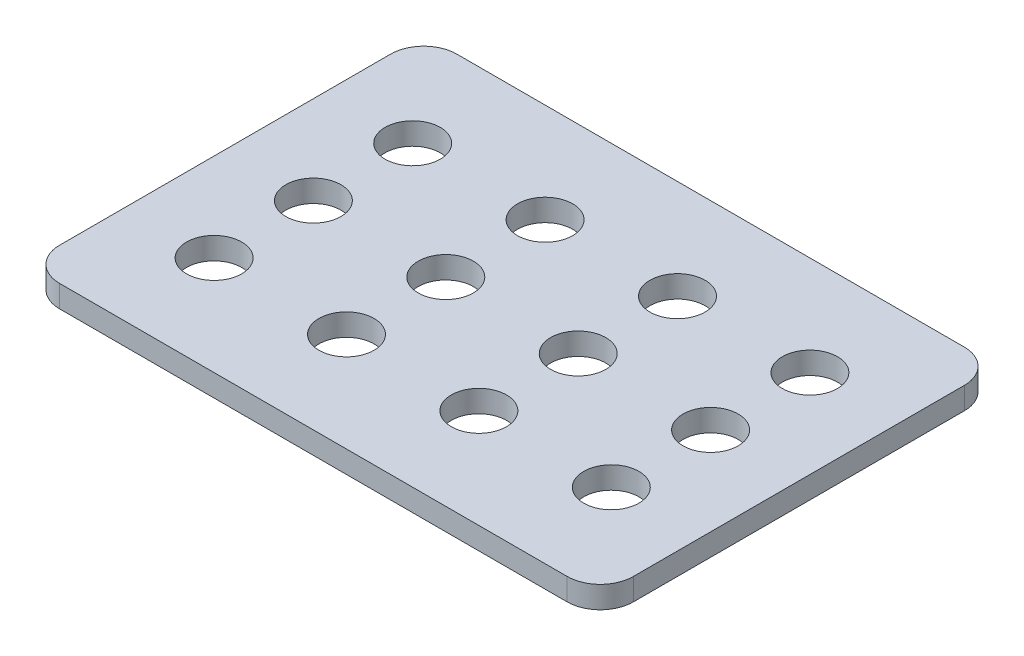
ISO-10303-21;
HEADER;
FILE_DESCRIPTION(('STEP AP214'),'2;1');
FILE_NAME('part.step','',(''),(''),'','','');
FILE_SCHEMA(('AUTOMOTIVE_DESIGN { 1 0 10303 214 1 1 1 1 }'));
ENDSEC;
DATA;
#1=APPLICATION_CONTEXT('core data for automotive mechanical design processes');
#2=APPLICATION_PROTOCOL_DEFINITION('international standard','automotive_design',2000,#1);
#3=PRODUCT_CONTEXT('',#1,'mechanical');
#4=PRODUCT('Part','Part','',(#3));
#5=PRODUCT_RELATED_PRODUCT_CATEGORY('part','',(#4));
#6=PRODUCT_DEFINITION_FORMATION('','',#4);
#7=PRODUCT_DEFINITION_CONTEXT('part definition',#1,'design');
#8=PRODUCT_DEFINITION('design','',#6,#7);
#9=PRODUCT_DEFINITION_SHAPE('','',#8);
#10=(LENGTH_UNIT() NAMED_UNIT(*) SI_UNIT(.MILLI.,.METRE.));
#11=(NAMED_UNIT(*) PLANE_ANGLE_UNIT() SI_UNIT($,.RADIAN.));
#12=(NAMED_UNIT(*) SI_UNIT($,.STERADIAN.) SOLID_ANGLE_UNIT());
#13=UNCERTAINTY_MEASURE_WITH_UNIT(LENGTH_MEASURE(1.E-05),#10,'distance_accuracy_value','');
#14=(GEOMETRIC_REPRESENTATION_CONTEXT(3) GLOBAL_UNCERTAINTY_ASSIGNED_CONTEXT((#13)) GLOBAL_UNIT_ASSIGNED_CONTEXT((#10,
#11,#12)) REPRESENTATION_CONTEXT('',''));
#15=CARTESIAN_POINT('',(0.,0.,0.));
#16=DIRECTION('',(0.,0.,1.));
#17=DIRECTION('',(1.,0.,0.));
#18=AXIS2_PLACEMENT_3D('',#15,#16,#17);
#19=CARTESIAN_POINT('',(15.,-10.,-15.));
#20=DIRECTION('',(0.,1.,0.));
#21=DIRECTION('',(0.,0.,1.));
#22=AXIS2_PLACEMENT_3D('',#19,#20,#21);
#23=CYLINDRICAL_SURFACE('',#22,15.);
#24=CARTESIAN_POINT('',(15.,0.,-15.));
#25=DIRECTION('',(0.,1.,0.));
#26=DIRECTION('',(0.,0.,-1.));
#27=AXIS2_PLACEMENT_3D('',#24,#25,#26);
#28=CIRCLE('',#27,15.);
#29=CARTESIAN_POINT('',(0.,0.,-15.0000000000001));
#30=VERTEX_POINT('',#29);
#31=CARTESIAN_POINT('',(15.0000000000001,0.,0.));
#32=VERTEX_POINT('',#31);
#33=EDGE_CURVE('E136',#30,#32,#28,.T.);
#34=ORIENTED_EDGE('',*,*,#33,.F.);
#35=DIRECTION('',(0.,1.,0.));
#36=VECTOR('',#35,1.);
#37=CARTESIAN_POINT('',(0.,-10.,-15.0000000000001));
#38=LINE('',#37,#36);
#39=CARTESIAN_POINT('',(0.,-10.,-15.0000000000001));
#40=VERTEX_POINT('',#39);
#41=EDGE_CURVE('E11',#40,#30,#38,.T.);
#42=ORIENTED_EDGE('',*,*,#41,.F.);
#43=CARTESIAN_POINT('',(15.,-10.,-15.));
#44=DIRECTION('',(0.,1.,0.));
#45=DIRECTION('',(0.,0.,-1.));
#46=AXIS2_PLACEMENT_3D('',#43,#44,#45);
#47=CIRCLE('',#46,15.);
#48=CARTESIAN_POINT('',(15.0000000000001,-10.,0.));
#49=VERTEX_POINT('',#48);
#50=EDGE_CURVE('E160',#40,#49,#47,.T.);
#51=ORIENTED_EDGE('',*,*,#50,.T.);
#52=DIRECTION('',(0.,1.,0.));
#53=VECTOR('',#52,1.);
#54=CARTESIAN_POINT('',(15.0000000000001,-10.,0.));
#55=LINE('',#54,#53);
#56=EDGE_CURVE('E45',#49,#32,#55,.T.);
#57=ORIENTED_EDGE('',*,*,#56,.T.);
#58=EDGE_LOOP('',(#34,#42,#51,#57));
#59=FACE_BOUND('',#58,.T.);
#60=ADVANCED_FACE('F39',(#59),#23,.T.);
#61=CARTESIAN_POINT('',(0.,-10.,-15.0000000000001));
#62=DIRECTION('',(-1.,0.,0.));
#63=DIRECTION('',(0.,0.,1.));
#64=AXIS2_PLACEMENT_3D('',#61,#62,#63);
#65=PLANE('',#64);
#66=DIRECTION('',(0.,0.,1.));
#67=VECTOR('',#66,1.);
#68=CARTESIAN_POINT('',(0.,0.,-15.0000000000001));
#69=LINE('',#68,#67);
#70=CARTESIAN_POINT('',(0.,0.,-165.));
#71=VERTEX_POINT('',#70);
#72=EDGE_CURVE('E153',#71,#30,#69,.T.);
#73=ORIENTED_EDGE('',*,*,#72,.F.);
#74=DIRECTION('',(0.,1.,0.));
#75=VECTOR('',#74,1.);
#76=CARTESIAN_POINT('',(0.,-10.,-165.));
#77=LINE('',#76,#75);
#78=CARTESIAN_POINT('',(0.,-10.,-165.));
#79=VERTEX_POINT('',#78);
#80=EDGE_CURVE('E48',#79,#71,#77,.T.);
#81=ORIENTED_EDGE('',*,*,#80,.F.);
#82=DIRECTION('',(0.,0.,1.));
#83=VECTOR('',#82,1.);
#84=CARTESIAN_POINT('',(0.,-10.,-15.0000000000001));
#85=LINE('',#84,#83);
#86=EDGE_CURVE('E128',#79,#40,#85,.T.);
#87=ORIENTED_EDGE('',*,*,#86,.T.);
#88=ORIENTED_EDGE('',*,*,#41,.T.);
#89=EDGE_LOOP('',(#73,#81,#87,#88));
#90=FACE_BOUND('',#89,.T.);
#91=ADVANCED_FACE('F170',(#90),#65,.T.);
#92=CARTESIAN_POINT('',(15.,-10.,-165.));
#93=DIRECTION('',(0.,1.,0.));
#94=DIRECTION('',(0.,0.,1.));
#95=AXIS2_PLACEMENT_3D('',#92,#93,#94);
#96=CYLINDRICAL_SURFACE('',#95,15.);
#97=CARTESIAN_POINT('',(15.,0.,-165.));
#98=DIRECTION('',(0.,1.,0.));
#99=DIRECTION('',(0.,0.,-1.));
#100=AXIS2_PLACEMENT_3D('',#97,#98,#99);
#101=CIRCLE('',#100,15.);
#102=CARTESIAN_POINT('',(15.0000000000001,0.,-180.));
#103=VERTEX_POINT('',#102);
#104=EDGE_CURVE('E111',#103,#71,#101,.T.);
#105=ORIENTED_EDGE('',*,*,#104,.F.);
#106=DIRECTION('',(0.,1.,0.));
#107=VECTOR('',#106,1.);
#108=CARTESIAN_POINT('',(15.0000000000001,-10.,-180.));
#109=LINE('',#108,#107);
#110=CARTESIAN_POINT('',(15.0000000000001,-10.,-180.));
#111=VERTEX_POINT('',#110);
#112=EDGE_CURVE('E110',#111,#103,#109,.T.);
#113=ORIENTED_EDGE('',*,*,#112,.F.);
#114=CARTESIAN_POINT('',(15.,-10.,-165.));
#115=DIRECTION('',(0.,1.,0.));
#116=DIRECTION('',(0.,0.,-1.));
#117=AXIS2_PLACEMENT_3D('',#114,#115,#116);
#118=CIRCLE('',#117,15.);
#119=EDGE_CURVE('E112',#111,#79,#118,.T.);
#120=ORIENTED_EDGE('',*,*,#119,.T.);
#121=ORIENTED_EDGE('',*,*,#80,.T.);
#122=EDGE_LOOP('',(#105,#113,#120,#121));
#123=FACE_BOUND('',#122,.T.);
#124=ADVANCED_FACE('F108',(#123),#96,.T.);
#125=CARTESIAN_POINT('',(15.0000000000001,-10.,-180.));
#126=DIRECTION('',(0.,0.,-1.));
#127=DIRECTION('',(-1.,0.,0.));
#128=AXIS2_PLACEMENT_3D('',#125,#126,#127);
#129=PLANE('',#128);
#130=DIRECTION('',(-1.,0.,0.));
#131=VECTOR('',#130,1.);
#132=CARTESIAN_POINT('',(15.0000000000001,0.,-180.));
#133=LINE('',#132,#131);
#134=CARTESIAN_POINT('',(245.,0.,-180.));
#135=VERTEX_POINT('',#134);
#136=EDGE_CURVE('E154',#135,#103,#133,.T.);
#137=ORIENTED_EDGE('',*,*,#136,.F.);
#138=DIRECTION('',(0.,1.,0.));
#139=VECTOR('',#138,1.);
#140=CARTESIAN_POINT('',(245.,-10.,-180.));
#141=LINE('',#140,#139);
#142=CARTESIAN_POINT('',(245.,-10.,-180.));
#143=VERTEX_POINT('',#142);
#144=EDGE_CURVE('E120',#143,#135,#141,.T.);
#145=ORIENTED_EDGE('',*,*,#144,.F.);
#146=DIRECTION('',(-1.,0.,0.));
#147=VECTOR('',#146,1.);
#148=CARTESIAN_POINT('',(15.0000000000001,-10.,-180.));
#149=LINE('',#148,#147);
#150=EDGE_CURVE('E125',#143,#111,#149,.T.);
#151=ORIENTED_EDGE('',*,*,#150,.T.);
#152=ORIENTED_EDGE('',*,*,#112,.T.);
#153=EDGE_LOOP('',(#137,#145,#151,#152));
#154=FACE_BOUND('',#153,.T.);
#155=ADVANCED_FACE('F126',(#154),#129,.T.);
#156=CARTESIAN_POINT('',(245.,-10.,-165.));
#157=DIRECTION('',(0.,1.,0.));
#158=DIRECTION('',(0.,0.,1.));
#159=AXIS2_PLACEMENT_3D('',#156,#157,#158);
#160=CYLINDRICAL_SURFACE('',#159,15.);
#161=CARTESIAN_POINT('',(245.,0.,-165.));
#162=DIRECTION('',(0.,1.,0.));
#163=DIRECTION('',(0.,0.,-1.));
#164=AXIS2_PLACEMENT_3D('',#161,#162,#163);
#165=CIRCLE('',#164,15.);
#166=CARTESIAN_POINT('',(260.,0.,-165.));
#167=VERTEX_POINT('',#166);
#168=EDGE_CURVE('E146',#167,#135,#165,.T.);
#169=ORIENTED_EDGE('',*,*,#168,.F.);
#170=DIRECTION('',(0.,1.,0.));
#171=VECTOR('',#170,1.);
#172=CARTESIAN_POINT('',(260.,-10.,-165.));
#173=LINE('',#172,#171);
#174=CARTESIAN_POINT('',(260.,-10.,-165.));
#175=VERTEX_POINT('',#174);
#176=EDGE_CURVE('E162',#175,#167,#173,.T.);
#177=ORIENTED_EDGE('',*,*,#176,.F.);
#178=CARTESIAN_POINT('',(245.,-10.,-165.));
#179=DIRECTION('',(0.,1.,0.));
#180=DIRECTION('',(0.,0.,-1.));
#181=AXIS2_PLACEMENT_3D('',#178,#179,#180);
#182=CIRCLE('',#181,15.);
#183=EDGE_CURVE('E129',#175,#143,#182,.T.);
#184=ORIENTED_EDGE('',*,*,#183,.T.);
#185=ORIENTED_EDGE('',*,*,#144,.T.);
#186=EDGE_LOOP('',(#169,#177,#184,#185));
#187=FACE_BOUND('',#186,.T.);
#188=ADVANCED_FACE('F185',(#187),#160,.T.);
#189=CARTESIAN_POINT('',(260.,-10.,-15.0000000000001));
#190=DIRECTION('',(1.,0.,0.));
#191=DIRECTION('',(0.,0.,-1.));
#192=AXIS2_PLACEMENT_3D('',#189,#190,#191);
#193=PLANE('',#192);
#194=DIRECTION('',(0.,0.,-1.));
#195=VECTOR('',#194,1.);
#196=CARTESIAN_POINT('',(260.,0.,-15.0000000000001));
#197=LINE('',#196,#195);
#198=CARTESIAN_POINT('',(260.,0.,-15.0000000000001));
#199=VERTEX_POINT('',#198);
#200=EDGE_CURVE('E147',#199,#167,#197,.T.);
#201=ORIENTED_EDGE('',*,*,#200,.F.);
#202=DIRECTION('',(0.,1.,0.));
#203=VECTOR('',#202,1.);
#204=CARTESIAN_POINT('',(260.,-10.,-15.0000000000001));
#205=LINE('',#204,#203);
#206=CARTESIAN_POINT('',(260.,-10.,-15.0000000000001));
#207=VERTEX_POINT('',#206);
#208=EDGE_CURVE('E165',#207,#199,#205,.T.);
#209=ORIENTED_EDGE('',*,*,#208,.F.);
#210=DIRECTION('',(0.,0.,-1.));
#211=VECTOR('',#210,1.);
#212=CARTESIAN_POINT('',(260.,-10.,-15.0000000000001));
#213=LINE('',#212,#211);
#214=EDGE_CURVE('E131',#207,#175,#213,.T.);
#215=ORIENTED_EDGE('',*,*,#214,.T.);
#216=ORIENTED_EDGE('',*,*,#176,.T.);
#217=EDGE_LOOP('',(#201,#209,#215,#216));
#218=FACE_BOUND('',#217,.T.);
#219=ADVANCED_FACE('F184',(#218),#193,.T.);
#220=CARTESIAN_POINT('',(245.,-10.,-15.));
#221=DIRECTION('',(0.,1.,0.));
#222=DIRECTION('',(0.,0.,1.));
#223=AXIS2_PLACEMENT_3D('',#220,#221,#222);
#224=CYLINDRICAL_SURFACE('',#223,15.);
#225=CARTESIAN_POINT('',(245.,0.,-15.));
#226=DIRECTION('',(0.,1.,0.));
#227=DIRECTION('',(0.,0.,1.));
#228=AXIS2_PLACEMENT_3D('',#225,#226,#227);
#229=CIRCLE('',#228,15.);
#230=CARTESIAN_POINT('',(245.,0.,0.));
#231=VERTEX_POINT('',#230);
#232=EDGE_CURVE('E142',#231,#199,#229,.T.);
#233=ORIENTED_EDGE('',*,*,#232,.F.);
#234=DIRECTION('',(0.,1.,0.));
#235=VECTOR('',#234,1.);
#236=CARTESIAN_POINT('',(245.,-10.,0.));
#237=LINE('',#236,#235);
#238=CARTESIAN_POINT('',(245.,-10.,0.));
#239=VERTEX_POINT('',#238);
#240=EDGE_CURVE('E161',#239,#231,#237,.T.);
#241=ORIENTED_EDGE('',*,*,#240,.F.);
#242=CARTESIAN_POINT('',(245.,-10.,-15.));
#243=DIRECTION('',(0.,1.,0.));
#244=DIRECTION('',(0.,0.,1.));
#245=AXIS2_PLACEMENT_3D('',#242,#243,#244);
#246=CIRCLE('',#245,15.);
#247=EDGE_CURVE('E332',#239,#207,#246,.T.);
#248=ORIENTED_EDGE('',*,*,#247,.T.);
#249=ORIENTED_EDGE('',*,*,#208,.T.);
#250=EDGE_LOOP('',(#233,#241,#248,#249));
#251=FACE_BOUND('',#250,.T.);
#252=ADVANCED_FACE('F188',(#251),#224,.T.);
#253=CARTESIAN_POINT('',(15.0000000000001,-10.,0.));
#254=DIRECTION('',(0.,0.,1.));
#255=DIRECTION('',(1.,0.,0.));
#256=AXIS2_PLACEMENT_3D('',#253,#254,#255);
#257=PLANE('',#256);
#258=DIRECTION('',(1.,0.,0.));
#259=VECTOR('',#258,1.);
#260=CARTESIAN_POINT('',(15.0000000000001,0.,0.));
#261=LINE('',#260,#259);
#262=EDGE_CURVE('E137',#32,#231,#261,.T.);
#263=ORIENTED_EDGE('',*,*,#262,.F.);
#264=ORIENTED_EDGE('',*,*,#56,.F.);
#265=DIRECTION('',(1.,0.,0.));
#266=VECTOR('',#265,1.);
#267=CARTESIAN_POINT('',(15.0000000000001,-10.,0.));
#268=LINE('',#267,#266);
#269=EDGE_CURVE('E326',#49,#239,#268,.T.);
#270=ORIENTED_EDGE('',*,*,#269,.T.);
#271=ORIENTED_EDGE('',*,*,#240,.T.);
#272=EDGE_LOOP('',(#263,#264,#270,#271));
#273=FACE_BOUND('',#272,.T.);
#274=ADVANCED_FACE('F168',(#273),#257,.T.);
#275=CARTESIAN_POINT('',(15.,-10.,-15.));
#276=DIRECTION('',(0.,-1.,0.));
#277=DIRECTION('',(0.,0.,-1.));
#278=AXIS2_PLACEMENT_3D('',#275,#276,#277);
#279=PLANE('',#278);
#280=CARTESIAN_POINT('',(40.0000000000009,-10.,-45.));
#281=DIRECTION('',(0.,1.,0.));
#282=DIRECTION('',(0.,0.,1.));
#283=AXIS2_PLACEMENT_3D('',#280,#281,#282);
#284=CIRCLE('',#283,12.5);
#285=CARTESIAN_POINT('',(40.0000000000009,-10.,-32.5));
#286=VERTEX_POINT('',#285);
#287=EDGE_CURVE('E258',#286,#286,#284,.T.);
#288=ORIENTED_EDGE('',*,*,#287,.T.);
#289=EDGE_LOOP('',(#288));
#290=FACE_BOUND('',#289,.T.);
#291=CARTESIAN_POINT('',(40.0000000000005,-10.,-90.));
#292=DIRECTION('',(0.,1.,0.));
#293=DIRECTION('',(0.,0.,1.));
#294=AXIS2_PLACEMENT_3D('',#291,#292,#293);
#295=CIRCLE('',#294,12.5);
#296=CARTESIAN_POINT('',(40.0000000000005,-10.,-77.5));
#297=VERTEX_POINT('',#296);
#298=EDGE_CURVE('E264',#297,#297,#295,.T.);
#299=ORIENTED_EDGE('',*,*,#298,.T.);
#300=EDGE_LOOP('',(#299));
#301=FACE_BOUND('',#300,.T.);
#302=CARTESIAN_POINT('',(220.000000000001,-10.,-45.));
#303=DIRECTION('',(0.,1.,0.));
#304=DIRECTION('',(0.,0.,1.));
#305=AXIS2_PLACEMENT_3D('',#302,#303,#304);
#306=CIRCLE('',#305,12.5);
#307=CARTESIAN_POINT('',(220.000000000001,-10.,-32.5));
#308=VERTEX_POINT('',#307);
#309=EDGE_CURVE('E269',#308,#308,#306,.T.);
#310=ORIENTED_EDGE('',*,*,#309,.T.);
#311=EDGE_LOOP('',(#310));
#312=FACE_BOUND('',#311,.T.);
#313=CARTESIAN_POINT('',(160.000000000001,-10.,-45.));
#314=DIRECTION('',(0.,1.,0.));
#315=DIRECTION('',(0.,0.,1.));
#316=AXIS2_PLACEMENT_3D('',#313,#314,#315);
#317=CIRCLE('',#316,12.5);
#318=CARTESIAN_POINT('',(160.000000000001,-10.,-32.5));
#319=VERTEX_POINT('',#318);
#320=EDGE_CURVE('E276',#319,#319,#317,.T.);
#321=ORIENTED_EDGE('',*,*,#320,.T.);
#322=EDGE_LOOP('',(#321));
#323=FACE_BOUND('',#322,.T.);
#324=CARTESIAN_POINT('',(100.000000000001,-10.,-45.));
#325=DIRECTION('',(0.,1.,0.));
#326=DIRECTION('',(0.,0.,1.));
#327=AXIS2_PLACEMENT_3D('',#324,#325,#326);
#328=CIRCLE('',#327,12.5);
#329=CARTESIAN_POINT('',(100.000000000001,-10.,-32.5));
#330=VERTEX_POINT('',#329);
#331=EDGE_CURVE('E285',#330,#330,#328,.T.);
#332=ORIENTED_EDGE('',*,*,#331,.T.);
#333=EDGE_LOOP('',(#332));
#334=FACE_BOUND('',#333,.T.);
#335=CARTESIAN_POINT('',(220.,-10.,-90.));
#336=DIRECTION('',(0.,1.,0.));
#337=DIRECTION('',(0.,0.,1.));
#338=AXIS2_PLACEMENT_3D('',#335,#336,#337);
#339=CIRCLE('',#338,12.5);
#340=CARTESIAN_POINT('',(220.,-10.,-77.5));
#341=VERTEX_POINT('',#340);
#342=EDGE_CURVE('E290',#341,#341,#339,.T.);
#343=ORIENTED_EDGE('',*,*,#342,.T.);
#344=EDGE_LOOP('',(#343));
#345=FACE_BOUND('',#344,.T.);
#346=CARTESIAN_POINT('',(160.,-10.,-90.));
#347=DIRECTION('',(0.,1.,0.));
#348=DIRECTION('',(0.,0.,1.));
#349=AXIS2_PLACEMENT_3D('',#346,#347,#348);
#350=CIRCLE('',#349,12.5);
#351=CARTESIAN_POINT('',(160.,-10.,-77.5));
#352=VERTEX_POINT('',#351);
#353=EDGE_CURVE('E294',#352,#352,#350,.T.);
#354=ORIENTED_EDGE('',*,*,#353,.T.);
#355=EDGE_LOOP('',(#354));
#356=FACE_BOUND('',#355,.T.);
#357=CARTESIAN_POINT('',(100.,-10.,-90.));
#358=DIRECTION('',(0.,1.,0.));
#359=DIRECTION('',(0.,0.,1.));
#360=AXIS2_PLACEMENT_3D('',#357,#358,#359);
#361=CIRCLE('',#360,12.5);
#362=CARTESIAN_POINT('',(100.,-10.,-77.5));
#363=VERTEX_POINT('',#362);
#364=EDGE_CURVE('E298',#363,#363,#361,.T.);
#365=ORIENTED_EDGE('',*,*,#364,.T.);
#366=EDGE_LOOP('',(#365));
#367=FACE_BOUND('',#366,.T.);
#368=CARTESIAN_POINT('',(220.,-10.,-135.));
#369=DIRECTION('',(0.,1.,0.));
#370=DIRECTION('',(0.,0.,1.));
#371=AXIS2_PLACEMENT_3D('',#368,#369,#370);
#372=CIRCLE('',#371,12.5);
#373=CARTESIAN_POINT('',(220.,-10.,-122.5));
#374=VERTEX_POINT('',#373);
#375=EDGE_CURVE('E308',#374,#374,#372,.T.);
#376=ORIENTED_EDGE('',*,*,#375,.T.);
#377=EDGE_LOOP('',(#376));
#378=FACE_BOUND('',#377,.T.);
#379=CARTESIAN_POINT('',(160.,-10.,-135.));
#380=DIRECTION('',(0.,1.,0.));
#381=DIRECTION('',(0.,0.,1.));
#382=AXIS2_PLACEMENT_3D('',#379,#380,#381);
#383=CIRCLE('',#382,12.5);
#384=CARTESIAN_POINT('',(160.,-10.,-122.5));
#385=VERTEX_POINT('',#384);
#386=EDGE_CURVE('E315',#385,#385,#383,.T.);
#387=ORIENTED_EDGE('',*,*,#386,.T.);
#388=EDGE_LOOP('',(#387));
#389=FACE_BOUND('',#388,.T.);
#390=CARTESIAN_POINT('',(100.,-10.,-135.));
#391=DIRECTION('',(0.,1.,0.));
#392=DIRECTION('',(0.,0.,1.));
#393=AXIS2_PLACEMENT_3D('',#390,#391,#392);
#394=CIRCLE('',#393,12.5);
#395=CARTESIAN_POINT('',(100.,-10.,-122.5));
#396=VERTEX_POINT('',#395);
#397=EDGE_CURVE('E318',#396,#396,#394,.T.);
#398=ORIENTED_EDGE('',*,*,#397,.T.);
#399=EDGE_LOOP('',(#398));
#400=FACE_BOUND('',#399,.T.);
#401=CARTESIAN_POINT('',(40.,-10.,-135.));
#402=DIRECTION('',(0.,1.,0.));
#403=DIRECTION('',(0.,0.,1.));
#404=AXIS2_PLACEMENT_3D('',#401,#402,#403);
#405=CIRCLE('',#404,12.5);
#406=CARTESIAN_POINT('',(40.,-10.,-122.5));
#407=VERTEX_POINT('',#406);
#408=EDGE_CURVE('E139',#407,#407,#405,.T.);
#409=ORIENTED_EDGE('',*,*,#408,.T.);
#410=EDGE_LOOP('',(#409));
#411=FACE_BOUND('',#410,.T.);
#412=ORIENTED_EDGE('',*,*,#50,.F.);
#413=ORIENTED_EDGE('',*,*,#86,.F.);
#414=ORIENTED_EDGE('',*,*,#119,.F.);
#415=ORIENTED_EDGE('',*,*,#150,.F.);
#416=ORIENTED_EDGE('',*,*,#183,.F.);
#417=ORIENTED_EDGE('',*,*,#214,.F.);
#418=ORIENTED_EDGE('',*,*,#247,.F.);
#419=ORIENTED_EDGE('',*,*,#269,.F.);
#420=EDGE_LOOP('',(#412,#413,#414,#415,#416,#417,#418,#419));
#421=FACE_BOUND('',#420,.T.);
#422=ADVANCED_FACE('F122',(#290,#301,#312,#323,#334,#345,#356,#367,#378,#389,#400,#411,#421),
#279,.T.);
#423=CARTESIAN_POINT('',(15.,0.,-15.));
#424=DIRECTION('',(0.,-1.,0.));
#425=DIRECTION('',(0.,0.,-1.));
#426=AXIS2_PLACEMENT_3D('',#423,#424,#425);
#427=PLANE('',#426);
#428=CARTESIAN_POINT('',(40.0000000000009,0.,-45.));
#429=DIRECTION('',(0.,1.,0.));
#430=DIRECTION('',(0.,0.,1.));
#431=AXIS2_PLACEMENT_3D('',#428,#429,#430);
#432=CIRCLE('',#431,12.5);
#433=CARTESIAN_POINT('',(40.0000000000009,0.,-32.5));
#434=VERTEX_POINT('',#433);
#435=EDGE_CURVE('E260',#434,#434,#432,.T.);
#436=ORIENTED_EDGE('',*,*,#435,.F.);
#437=EDGE_LOOP('',(#436));
#438=FACE_BOUND('',#437,.T.);
#439=CARTESIAN_POINT('',(40.0000000000005,0.,-90.));
#440=DIRECTION('',(0.,1.,0.));
#441=DIRECTION('',(0.,0.,1.));
#442=AXIS2_PLACEMENT_3D('',#439,#440,#441);
#443=CIRCLE('',#442,12.5);
#444=CARTESIAN_POINT('',(40.0000000000005,0.,-77.5));
#445=VERTEX_POINT('',#444);
#446=EDGE_CURVE('E263',#445,#445,#443,.T.);
#447=ORIENTED_EDGE('',*,*,#446,.F.);
#448=EDGE_LOOP('',(#447));
#449=FACE_BOUND('',#448,.T.);
#450=CARTESIAN_POINT('',(220.000000000001,0.,-45.));
#451=DIRECTION('',(0.,1.,0.));
#452=DIRECTION('',(0.,0.,1.));
#453=AXIS2_PLACEMENT_3D('',#450,#451,#452);
#454=CIRCLE('',#453,12.5);
#455=CARTESIAN_POINT('',(220.000000000001,0.,-32.5));
#456=VERTEX_POINT('',#455);
#457=EDGE_CURVE('E270',#456,#456,#454,.T.);
#458=ORIENTED_EDGE('',*,*,#457,.F.);
#459=EDGE_LOOP('',(#458));
#460=FACE_BOUND('',#459,.T.);
#461=CARTESIAN_POINT('',(160.000000000001,0.,-45.));
#462=DIRECTION('',(0.,1.,0.));
#463=DIRECTION('',(0.,0.,1.));
#464=AXIS2_PLACEMENT_3D('',#461,#462,#463);
#465=CIRCLE('',#464,12.5);
#466=CARTESIAN_POINT('',(160.000000000001,0.,-32.5));
#467=VERTEX_POINT('',#466);
#468=EDGE_CURVE('E273',#467,#467,#465,.T.);
#469=ORIENTED_EDGE('',*,*,#468,.F.);
#470=EDGE_LOOP('',(#469));
#471=FACE_BOUND('',#470,.T.);
#472=CARTESIAN_POINT('',(100.000000000001,0.,-45.));
#473=DIRECTION('',(0.,1.,0.));
#474=DIRECTION('',(0.,0.,1.));
#475=AXIS2_PLACEMENT_3D('',#472,#473,#474);
#476=CIRCLE('',#475,12.5);
#477=CARTESIAN_POINT('',(100.000000000001,0.,-32.5));
#478=VERTEX_POINT('',#477);
#479=EDGE_CURVE('E278',#478,#478,#476,.T.);
#480=ORIENTED_EDGE('',*,*,#479,.F.);
#481=EDGE_LOOP('',(#480));
#482=FACE_BOUND('',#481,.T.);
#483=CARTESIAN_POINT('',(220.,0.,-90.));
#484=DIRECTION('',(0.,1.,0.));
#485=DIRECTION('',(0.,0.,1.));
#486=AXIS2_PLACEMENT_3D('',#483,#484,#485);
#487=CIRCLE('',#486,12.5);
#488=CARTESIAN_POINT('',(220.,0.,-77.5));
#489=VERTEX_POINT('',#488);
#490=EDGE_CURVE('E283',#489,#489,#487,.T.);
#491=ORIENTED_EDGE('',*,*,#490,.F.);
#492=EDGE_LOOP('',(#491));
#493=FACE_BOUND('',#492,.T.);
#494=CARTESIAN_POINT('',(160.,0.,-90.));
#495=DIRECTION('',(0.,1.,0.));
#496=DIRECTION('',(0.,0.,1.));
#497=AXIS2_PLACEMENT_3D('',#494,#495,#496);
#498=CIRCLE('',#497,12.5);
#499=CARTESIAN_POINT('',(160.,0.,-77.5));
#500=VERTEX_POINT('',#499);
#501=EDGE_CURVE('E292',#500,#500,#498,.T.);
#502=ORIENTED_EDGE('',*,*,#501,.F.);
#503=EDGE_LOOP('',(#502));
#504=FACE_BOUND('',#503,.T.);
#505=CARTESIAN_POINT('',(100.,0.,-90.));
#506=DIRECTION('',(0.,1.,0.));
#507=DIRECTION('',(0.,0.,1.));
#508=AXIS2_PLACEMENT_3D('',#505,#506,#507);
#509=CIRCLE('',#508,12.5);
#510=CARTESIAN_POINT('',(100.,0.,-77.5));
#511=VERTEX_POINT('',#510);
#512=EDGE_CURVE('E299',#511,#511,#509,.T.);
#513=ORIENTED_EDGE('',*,*,#512,.F.);
#514=EDGE_LOOP('',(#513));
#515=FACE_BOUND('',#514,.T.);
#516=CARTESIAN_POINT('',(220.,0.,-135.));
#517=DIRECTION('',(0.,1.,0.));
#518=DIRECTION('',(0.,0.,1.));
#519=AXIS2_PLACEMENT_3D('',#516,#517,#518);
#520=CIRCLE('',#519,12.5);
#521=CARTESIAN_POINT('',(220.,0.,-122.5));
#522=VERTEX_POINT('',#521);
#523=EDGE_CURVE('E301',#522,#522,#520,.T.);
#524=ORIENTED_EDGE('',*,*,#523,.F.);
#525=EDGE_LOOP('',(#524));
#526=FACE_BOUND('',#525,.T.);
#527=CARTESIAN_POINT('',(160.,0.,-135.));
#528=DIRECTION('',(0.,1.,0.));
#529=DIRECTION('',(0.,0.,1.));
#530=AXIS2_PLACEMENT_3D('',#527,#528,#529);
#531=CIRCLE('',#530,12.5);
#532=CARTESIAN_POINT('',(160.,0.,-122.5));
#533=VERTEX_POINT('',#532);
#534=EDGE_CURVE('E309',#533,#533,#531,.T.);
#535=ORIENTED_EDGE('',*,*,#534,.F.);
#536=EDGE_LOOP('',(#535));
#537=FACE_BOUND('',#536,.T.);
#538=CARTESIAN_POINT('',(100.,0.,-135.));
#539=DIRECTION('',(0.,1.,0.));
#540=DIRECTION('',(0.,0.,1.));
#541=AXIS2_PLACEMENT_3D('',#538,#539,#540);
#542=CIRCLE('',#541,12.5);
#543=CARTESIAN_POINT('',(100.,0.,-122.5));
#544=VERTEX_POINT('',#543);
#545=EDGE_CURVE('E314',#544,#544,#542,.T.);
#546=ORIENTED_EDGE('',*,*,#545,.F.);
#547=EDGE_LOOP('',(#546));
#548=FACE_BOUND('',#547,.T.);
#549=CARTESIAN_POINT('',(40.,0.,-135.));
#550=DIRECTION('',(0.,1.,0.));
#551=DIRECTION('',(0.,0.,1.));
#552=AXIS2_PLACEMENT_3D('',#549,#550,#551);
#553=CIRCLE('',#552,12.5);
#554=CARTESIAN_POINT('',(40.,0.,-122.5));
#555=VERTEX_POINT('',#554);
#556=EDGE_CURVE('E321',#555,#555,#553,.T.);
#557=ORIENTED_EDGE('',*,*,#556,.F.);
#558=EDGE_LOOP('',(#557));
#559=FACE_BOUND('',#558,.T.);
#560=ORIENTED_EDGE('',*,*,#33,.T.);
#561=ORIENTED_EDGE('',*,*,#262,.T.);
#562=ORIENTED_EDGE('',*,*,#232,.T.);
#563=ORIENTED_EDGE('',*,*,#200,.T.);
#564=ORIENTED_EDGE('',*,*,#168,.T.);
#565=ORIENTED_EDGE('',*,*,#136,.T.);
#566=ORIENTED_EDGE('',*,*,#104,.T.);
#567=ORIENTED_EDGE('',*,*,#72,.T.);
#568=EDGE_LOOP('',(#560,#561,#562,#563,#564,#565,#566,#567));
#569=FACE_BOUND('',#568,.T.);
#570=ADVANCED_FACE('F166',(#438,#449,#460,#471,#482,#493,#504,#515,#526,#537,#548,#559,#569),
#427,.F.);
#571=CARTESIAN_POINT('',(40.,-10.,-135.));
#572=DIRECTION('',(0.,1.,0.));
#573=DIRECTION('',(0.,0.,1.));
#574=AXIS2_PLACEMENT_3D('',#571,#572,#573);
#575=CYLINDRICAL_SURFACE('',#574,12.5);
#576=ORIENTED_EDGE('',*,*,#408,.F.);
#577=EDGE_LOOP('',(#576));
#578=FACE_BOUND('',#577,.T.);
#579=ORIENTED_EDGE('',*,*,#556,.T.);
#580=EDGE_LOOP('',(#579));
#581=FACE_BOUND('',#580,.T.);
#582=ADVANCED_FACE('F202',(#578,#581),#575,.F.);
#583=CARTESIAN_POINT('',(100.,-10.,-135.));
#584=DIRECTION('',(0.,1.,0.));
#585=DIRECTION('',(0.,0.,1.));
#586=AXIS2_PLACEMENT_3D('',#583,#584,#585);
#587=CYLINDRICAL_SURFACE('',#586,12.5);
#588=ORIENTED_EDGE('',*,*,#397,.F.);
#589=EDGE_LOOP('',(#588));
#590=FACE_BOUND('',#589,.T.);
#591=ORIENTED_EDGE('',*,*,#545,.T.);
#592=EDGE_LOOP('',(#591));
#593=FACE_BOUND('',#592,.T.);
#594=ADVANCED_FACE('F210',(#590,#593),#587,.F.);
#595=CARTESIAN_POINT('',(160.,-10.,-135.));
#596=DIRECTION('',(0.,1.,0.));
#597=DIRECTION('',(0.,0.,1.));
#598=AXIS2_PLACEMENT_3D('',#595,#596,#597);
#599=CYLINDRICAL_SURFACE('',#598,12.5);
#600=ORIENTED_EDGE('',*,*,#386,.F.);
#601=EDGE_LOOP('',(#600));
#602=FACE_BOUND('',#601,.T.);
#603=ORIENTED_EDGE('',*,*,#534,.T.);
#604=EDGE_LOOP('',(#603));
#605=FACE_BOUND('',#604,.T.);
#606=ADVANCED_FACE('F212',(#602,#605),#599,.F.);
#607=CARTESIAN_POINT('',(220.,-10.,-135.));
#608=DIRECTION('',(0.,1.,0.));
#609=DIRECTION('',(0.,0.,1.));
#610=AXIS2_PLACEMENT_3D('',#607,#608,#609);
#611=CYLINDRICAL_SURFACE('',#610,12.5);
#612=ORIENTED_EDGE('',*,*,#375,.F.);
#613=EDGE_LOOP('',(#612));
#614=FACE_BOUND('',#613,.T.);
#615=ORIENTED_EDGE('',*,*,#523,.T.);
#616=EDGE_LOOP('',(#615));
#617=FACE_BOUND('',#616,.T.);
#618=ADVANCED_FACE('F218',(#614,#617),#611,.F.);
#619=CARTESIAN_POINT('',(100.,-10.,-90.));
#620=DIRECTION('',(0.,1.,0.));
#621=DIRECTION('',(0.,0.,1.));
#622=AXIS2_PLACEMENT_3D('',#619,#620,#621);
#623=CYLINDRICAL_SURFACE('',#622,12.5);
#624=ORIENTED_EDGE('',*,*,#364,.F.);
#625=EDGE_LOOP('',(#624));
#626=FACE_BOUND('',#625,.T.);
#627=ORIENTED_EDGE('',*,*,#512,.T.);
#628=EDGE_LOOP('',(#627));
#629=FACE_BOUND('',#628,.T.);
#630=ADVANCED_FACE('F217',(#626,#629),#623,.F.);
#631=CARTESIAN_POINT('',(160.,-10.,-90.));
#632=DIRECTION('',(0.,1.,0.));
#633=DIRECTION('',(0.,0.,1.));
#634=AXIS2_PLACEMENT_3D('',#631,#632,#633);
#635=CYLINDRICAL_SURFACE('',#634,12.5);
#636=ORIENTED_EDGE('',*,*,#353,.F.);
#637=EDGE_LOOP('',(#636));
#638=FACE_BOUND('',#637,.T.);
#639=ORIENTED_EDGE('',*,*,#501,.T.);
#640=EDGE_LOOP('',(#639));
#641=FACE_BOUND('',#640,.T.);
#642=ADVANCED_FACE('F222',(#638,#641),#635,.F.);
#643=CARTESIAN_POINT('',(220.,-10.,-90.));
#644=DIRECTION('',(0.,1.,0.));
#645=DIRECTION('',(0.,0.,1.));
#646=AXIS2_PLACEMENT_3D('',#643,#644,#645);
#647=CYLINDRICAL_SURFACE('',#646,12.5);
#648=ORIENTED_EDGE('',*,*,#342,.F.);
#649=EDGE_LOOP('',(#648));
#650=FACE_BOUND('',#649,.T.);
#651=ORIENTED_EDGE('',*,*,#490,.T.);
#652=EDGE_LOOP('',(#651));
#653=FACE_BOUND('',#652,.T.);
#654=ADVANCED_FACE('F228',(#650,#653),#647,.F.);
#655=CARTESIAN_POINT('',(100.000000000001,-10.,-45.));
#656=DIRECTION('',(0.,1.,0.));
#657=DIRECTION('',(0.,0.,1.));
#658=AXIS2_PLACEMENT_3D('',#655,#656,#657);
#659=CYLINDRICAL_SURFACE('',#658,12.5);
#660=ORIENTED_EDGE('',*,*,#331,.F.);
#661=EDGE_LOOP('',(#660));
#662=FACE_BOUND('',#661,.T.);
#663=ORIENTED_EDGE('',*,*,#479,.T.);
#664=EDGE_LOOP('',(#663));
#665=FACE_BOUND('',#664,.T.);
#666=ADVANCED_FACE('F235',(#662,#665),#659,.F.);
#667=CARTESIAN_POINT('',(160.000000000001,-10.,-45.));
#668=DIRECTION('',(0.,1.,0.));
#669=DIRECTION('',(0.,0.,1.));
#670=AXIS2_PLACEMENT_3D('',#667,#668,#669);
#671=CYLINDRICAL_SURFACE('',#670,12.5);
#672=ORIENTED_EDGE('',*,*,#320,.F.);
#673=EDGE_LOOP('',(#672));
#674=FACE_BOUND('',#673,.T.);
#675=ORIENTED_EDGE('',*,*,#468,.T.);
#676=EDGE_LOOP('',(#675));
#677=FACE_BOUND('',#676,.T.);
#678=ADVANCED_FACE('F237',(#674,#677),#671,.F.);
#679=CARTESIAN_POINT('',(220.000000000001,-10.,-45.));
#680=DIRECTION('',(0.,1.,0.));
#681=DIRECTION('',(0.,0.,1.));
#682=AXIS2_PLACEMENT_3D('',#679,#680,#681);
#683=CYLINDRICAL_SURFACE('',#682,12.5);
#684=ORIENTED_EDGE('',*,*,#309,.F.);
#685=EDGE_LOOP('',(#684));
#686=FACE_BOUND('',#685,.T.);
#687=ORIENTED_EDGE('',*,*,#457,.T.);
#688=EDGE_LOOP('',(#687));
#689=FACE_BOUND('',#688,.T.);
#690=ADVANCED_FACE('F238',(#686,#689),#683,.F.);
#691=CARTESIAN_POINT('',(40.0000000000005,-10.,-90.));
#692=DIRECTION('',(0.,1.,0.));
#693=DIRECTION('',(0.,0.,1.));
#694=AXIS2_PLACEMENT_3D('',#691,#692,#693);
#695=CYLINDRICAL_SURFACE('',#694,12.5);
#696=ORIENTED_EDGE('',*,*,#298,.F.);
#697=EDGE_LOOP('',(#696));
#698=FACE_BOUND('',#697,.T.);
#699=ORIENTED_EDGE('',*,*,#446,.T.);
#700=EDGE_LOOP('',(#699));
#701=FACE_BOUND('',#700,.T.);
#702=ADVANCED_FACE('F241',(#698,#701),#695,.F.);
#703=CARTESIAN_POINT('',(40.0000000000009,-10.,-45.));
#704=DIRECTION('',(0.,1.,0.));
#705=DIRECTION('',(0.,0.,1.));
#706=AXIS2_PLACEMENT_3D('',#703,#704,#705);
#707=CYLINDRICAL_SURFACE('',#706,12.5);
#708=ORIENTED_EDGE('',*,*,#287,.F.);
#709=EDGE_LOOP('',(#708));
#710=FACE_BOUND('',#709,.T.);
#711=ORIENTED_EDGE('',*,*,#435,.T.);
#712=EDGE_LOOP('',(#711));
#713=FACE_BOUND('',#712,.T.);
#714=ADVANCED_FACE('F246',(#710,#713),#707,.F.);
#715=CLOSED_SHELL('',(#60,#91,#124,#155,#188,#219,#252,#274,#422,#570,#582,#594,#606,#618,#630,
#642,#654,#666,#678,#690,#702,#714));
#716=MANIFOLD_SOLID_BREP('B2',#715);
#717=ADVANCED_BREP_SHAPE_REPRESENTATION('',(#18,#716),#14);
#718=SHAPE_DEFINITION_REPRESENTATION(#9,#717);
ENDSEC;
END-ISO-10303-21;
